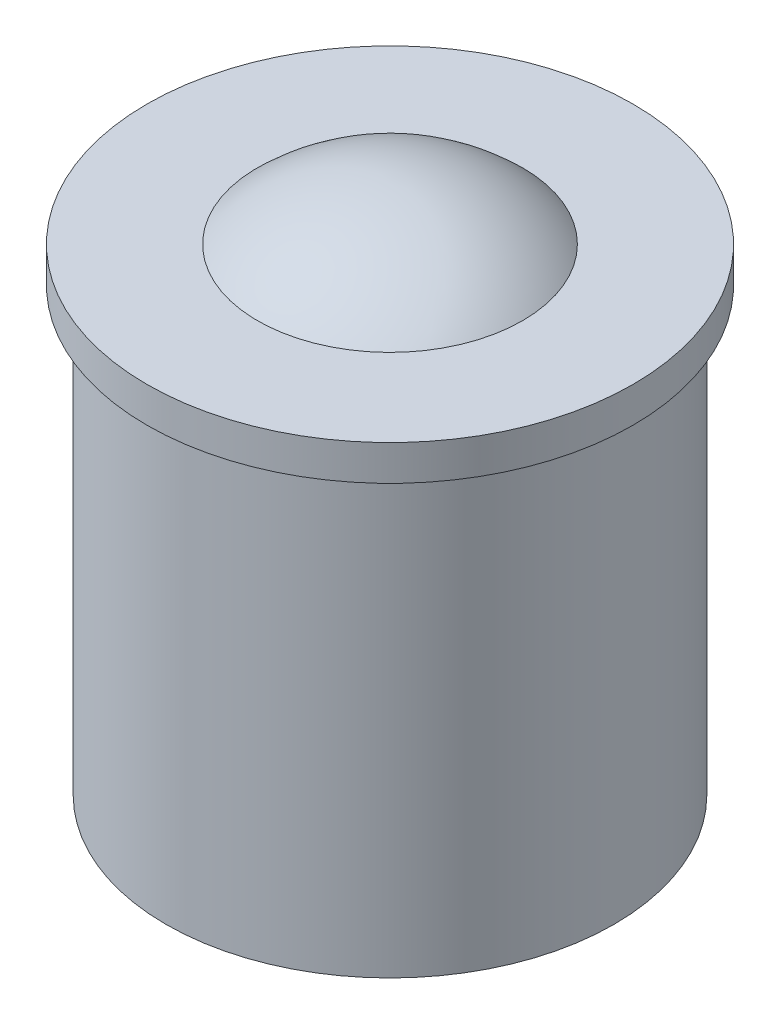
ISO-10303-21;
HEADER;
FILE_DESCRIPTION(('STEP AP214'),'2;1');
FILE_NAME('part.step','',(''),(''),'','','');
FILE_SCHEMA(('AUTOMOTIVE_DESIGN { 1 0 10303 214 1 1 1 1 }'));
ENDSEC;
DATA;
#1=APPLICATION_CONTEXT('core data for automotive mechanical design processes');
#2=APPLICATION_PROTOCOL_DEFINITION('international standard','automotive_design',2000,#1);
#3=PRODUCT_CONTEXT('',#1,'mechanical');
#4=PRODUCT('Part','Part','',(#3));
#5=PRODUCT_RELATED_PRODUCT_CATEGORY('part','',(#4));
#6=PRODUCT_DEFINITION_FORMATION('','',#4);
#7=PRODUCT_DEFINITION_CONTEXT('part definition',#1,'design');
#8=PRODUCT_DEFINITION('design','',#6,#7);
#9=PRODUCT_DEFINITION_SHAPE('','',#8);
#10=(LENGTH_UNIT() NAMED_UNIT(*) SI_UNIT(.MILLI.,.METRE.));
#11=(NAMED_UNIT(*) PLANE_ANGLE_UNIT() SI_UNIT($,.RADIAN.));
#12=(NAMED_UNIT(*) SI_UNIT($,.STERADIAN.) SOLID_ANGLE_UNIT());
#13=UNCERTAINTY_MEASURE_WITH_UNIT(LENGTH_MEASURE(1.E-05),#10,'distance_accuracy_value','');
#14=(GEOMETRIC_REPRESENTATION_CONTEXT(3) GLOBAL_UNCERTAINTY_ASSIGNED_CONTEXT((#13)) GLOBAL_UNIT_ASSIGNED_CONTEXT((#10,
#11,#12)) REPRESENTATION_CONTEXT('',''));
#15=CARTESIAN_POINT('',(0.,0.,0.));
#16=DIRECTION('',(0.,0.,1.));
#17=DIRECTION('',(1.,0.,0.));
#18=AXIS2_PLACEMENT_3D('',#15,#16,#17);
#19=CARTESIAN_POINT('',(0.,0.,0.));
#20=DIRECTION('',(0.,-1.,0.));
#21=DIRECTION('',(0.,0.,-1.));
#22=AXIS2_PLACEMENT_3D('',#19,#20,#21);
#23=PLANE('',#22);
#24=CARTESIAN_POINT('',(0.,0.,0.));
#25=DIRECTION('',(0.,-1.,0.));
#26=DIRECTION('',(0.,0.,-1.));
#27=AXIS2_PLACEMENT_3D('',#24,#25,#26);
#28=CIRCLE('',#27,4.0259);
#29=CARTESIAN_POINT('',(0.,0.,-4.0259));
#30=VERTEX_POINT('',#29);
#31=EDGE_CURVE('E10',#30,#30,#28,.T.);
#32=ORIENTED_EDGE('',*,*,#31,.T.);
#33=EDGE_LOOP('',(#32));
#34=FACE_BOUND('',#33,.T.);
#35=ADVANCED_FACE('F34',(#34),#23,.T.);
#36=CARTESIAN_POINT('',(0.,-5.8151888888889,0.));
#37=DIRECTION('',(0.,-1.,0.));
#38=DIRECTION('',(0.,0.,-1.));
#39=AXIS2_PLACEMENT_3D('',#36,#37,#38);
#40=CYLINDRICAL_SURFACE('',#39,4.0259);
#41=CARTESIAN_POINT('',(0.,7.9375,0.));
#42=DIRECTION('',(0.,-1.,0.));
#43=DIRECTION('',(0.,0.,-1.));
#44=AXIS2_PLACEMENT_3D('',#41,#42,#43);
#45=CIRCLE('',#44,4.0259);
#46=CARTESIAN_POINT('',(0.,7.9375,-4.0259));
#47=VERTEX_POINT('',#46);
#48=EDGE_CURVE('E40',#47,#47,#45,.T.);
#49=ORIENTED_EDGE('',*,*,#48,.T.);
#50=EDGE_LOOP('',(#49));
#51=FACE_BOUND('',#50,.T.);
#52=ORIENTED_EDGE('',*,*,#31,.F.);
#53=EDGE_LOOP('',(#52));
#54=FACE_BOUND('',#53,.T.);
#55=ADVANCED_FACE('F69',(#51,#54),#40,.T.);
#56=CARTESIAN_POINT('',(4.0259,7.9375,0.));
#57=DIRECTION('',(0.,-1.,0.));
#58=DIRECTION('',(0.,0.,-1.));
#59=AXIS2_PLACEMENT_3D('',#56,#57,#58);
#60=PLANE('',#59);
#61=CARTESIAN_POINT('',(0.,7.9375,0.));
#62=DIRECTION('',(0.,-1.,0.));
#63=DIRECTION('',(0.,0.,-1.));
#64=AXIS2_PLACEMENT_3D('',#61,#62,#63);
#65=CIRCLE('',#64,4.365625);
#66=CARTESIAN_POINT('',(0.,7.9375,-4.365625));
#67=VERTEX_POINT('',#66);
#68=EDGE_CURVE('E44',#67,#67,#65,.T.);
#69=ORIENTED_EDGE('',*,*,#68,.T.);
#70=EDGE_LOOP('',(#69));
#71=FACE_BOUND('',#70,.T.);
#72=ORIENTED_EDGE('',*,*,#48,.F.);
#73=EDGE_LOOP('',(#72));
#74=FACE_BOUND('',#73,.T.);
#75=ADVANCED_FACE('F73',(#71,#74),#60,.T.);
#76=CARTESIAN_POINT('',(0.,-5.8151888888889,0.));
#77=DIRECTION('',(0.,-1.,0.));
#78=DIRECTION('',(0.,0.,-1.));
#79=AXIS2_PLACEMENT_3D('',#76,#77,#78);
#80=CYLINDRICAL_SURFACE('',#79,4.365625);
#81=CARTESIAN_POINT('',(0.,8.5725,0.));
#82=DIRECTION('',(0.,-1.,0.));
#83=DIRECTION('',(0.,0.,-1.));
#84=AXIS2_PLACEMENT_3D('',#81,#82,#83);
#85=CIRCLE('',#84,4.365625);
#86=CARTESIAN_POINT('',(0.,8.5725,-4.365625));
#87=VERTEX_POINT('',#86);
#88=EDGE_CURVE('E48',#87,#87,#85,.T.);
#89=ORIENTED_EDGE('',*,*,#88,.T.);
#90=EDGE_LOOP('',(#89));
#91=FACE_BOUND('',#90,.T.);
#92=ORIENTED_EDGE('',*,*,#68,.F.);
#93=EDGE_LOOP('',(#92));
#94=FACE_BOUND('',#93,.T.);
#95=ADVANCED_FACE('F66',(#91,#94),#80,.T.);
#96=CARTESIAN_POINT('',(4.365625,8.5725,0.));
#97=DIRECTION('',(0.,1.,0.));
#98=DIRECTION('',(0.,0.,1.));
#99=AXIS2_PLACEMENT_3D('',#96,#97,#98);
#100=PLANE('',#99);
#101=CARTESIAN_POINT('',(0.,8.5725,0.));
#102=DIRECTION('',(0.,-1.,0.));
#103=DIRECTION('',(0.,0.,-1.));
#104=AXIS2_PLACEMENT_3D('',#101,#102,#103);
#105=CIRCLE('',#104,2.38125);
#106=CARTESIAN_POINT('',(0.,8.5725,-2.38125));
#107=VERTEX_POINT('',#106);
#108=EDGE_CURVE('E53',#107,#107,#105,.T.);
#109=ORIENTED_EDGE('',*,*,#108,.T.);
#110=EDGE_LOOP('',(#109));
#111=FACE_BOUND('',#110,.T.);
#112=ORIENTED_EDGE('',*,*,#88,.F.);
#113=EDGE_LOOP('',(#112));
#114=FACE_BOUND('',#113,.T.);
#115=ADVANCED_FACE('F57',(#111,#114),#100,.T.);
#116=CARTESIAN_POINT('',(0.,6.0721875,0.));
#117=DIRECTION('',(0.,-1.,0.));
#118=DIRECTION('',(1.,0.,0.));
#119=AXIS2_PLACEMENT_3D('',#116,#117,#118);
#120=SPHERICAL_SURFACE('',#119,3.4528125);
#121=ORIENTED_EDGE('',*,*,#108,.F.);
#122=EDGE_LOOP('',(#121));
#123=FACE_BOUND('',#122,.T.);
#124=ADVANCED_FACE('F60',(#123),#120,.T.);
#125=CLOSED_SHELL('',(#35,#55,#75,#95,#115,#124));
#126=MANIFOLD_SOLID_BREP('B2',#125);
#127=ADVANCED_BREP_SHAPE_REPRESENTATION('',(#18,#126),#14);
#128=SHAPE_DEFINITION_REPRESENTATION(#9,#127);
ENDSEC;
END-ISO-10303-21;
